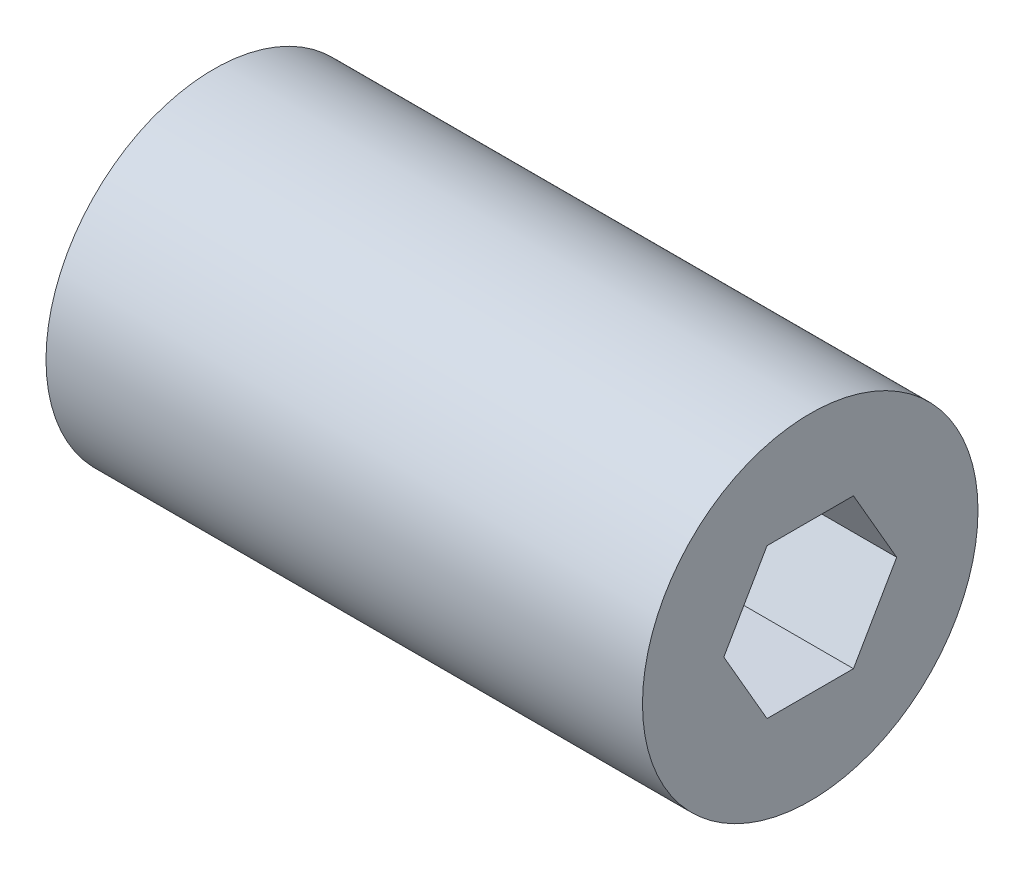
ISO-10303-21;
HEADER;
FILE_DESCRIPTION(('STEP AP214'),'2;1');
FILE_NAME('part.step','',(''),(''),'','','');
FILE_SCHEMA(('AUTOMOTIVE_DESIGN { 1 0 10303 214 1 1 1 1 }'));
ENDSEC;
DATA;
#1=APPLICATION_CONTEXT('core data for automotive mechanical design processes');
#2=APPLICATION_PROTOCOL_DEFINITION('international standard','automotive_design',2000,#1);
#3=PRODUCT_CONTEXT('',#1,'mechanical');
#4=PRODUCT('Part','Part','',(#3));
#5=PRODUCT_RELATED_PRODUCT_CATEGORY('part','',(#4));
#6=PRODUCT_DEFINITION_FORMATION('','',#4);
#7=PRODUCT_DEFINITION_CONTEXT('part definition',#1,'design');
#8=PRODUCT_DEFINITION('design','',#6,#7);
#9=PRODUCT_DEFINITION_SHAPE('','',#8);
#10=(LENGTH_UNIT() NAMED_UNIT(*) SI_UNIT(.MILLI.,.METRE.));
#11=(NAMED_UNIT(*) PLANE_ANGLE_UNIT() SI_UNIT($,.RADIAN.));
#12=(NAMED_UNIT(*) SI_UNIT($,.STERADIAN.) SOLID_ANGLE_UNIT());
#13=UNCERTAINTY_MEASURE_WITH_UNIT(LENGTH_MEASURE(1.E-05),#10,'distance_accuracy_value','');
#14=(GEOMETRIC_REPRESENTATION_CONTEXT(3) GLOBAL_UNCERTAINTY_ASSIGNED_CONTEXT((#13)) GLOBAL_UNIT_ASSIGNED_CONTEXT((#10,
#11,#12)) REPRESENTATION_CONTEXT('',''));
#15=CARTESIAN_POINT('',(0.,0.,0.));
#16=DIRECTION('',(0.,0.,1.));
#17=DIRECTION('',(1.,0.,0.));
#18=AXIS2_PLACEMENT_3D('',#15,#16,#17);
#19=CARTESIAN_POINT('',(25.4,-6.3754,3.68083890619154));
#20=DIRECTION('',(0.,1.,0.));
#21=DIRECTION('',(0.,0.,1.));
#22=AXIS2_PLACEMENT_3D('',#19,#20,#21);
#23=PLANE('',#22);
#24=DIRECTION('',(0.,0.,-1.));
#25=VECTOR('',#24,1.);
#26=CARTESIAN_POINT('',(25.4,-6.37540000000001,0.));
#27=LINE('',#26,#25);
#28=CARTESIAN_POINT('',(25.4,-6.37540000000001,-3.68083890619154));
#29=VERTEX_POINT('',#28);
#30=CARTESIAN_POINT('',(25.4,-6.3754,3.68083890619154));
#31=VERTEX_POINT('',#30);
#32=EDGE_CURVE('E84',#29,#31,#27,.F.);
#33=ORIENTED_EDGE('',*,*,#32,.F.);
#34=DIRECTION('',(1.,0.,0.));
#35=VECTOR('',#34,1.);
#36=CARTESIAN_POINT('',(25.4,-6.37540000000001,-3.68083890619154));
#37=LINE('',#36,#35);
#38=CARTESIAN_POINT('',(-25.4,-6.37540000000001,-3.68083890619154));
#39=VERTEX_POINT('',#38);
#40=EDGE_CURVE('E76',#39,#29,#37,.T.);
#41=ORIENTED_EDGE('',*,*,#40,.F.);
#42=DIRECTION('',(0.,0.,-1.));
#43=VECTOR('',#42,1.);
#44=CARTESIAN_POINT('',(-25.4,-6.37540000000001,0.));
#45=LINE('',#44,#43);
#46=CARTESIAN_POINT('',(-25.4,-6.3754,3.68083890619154));
#47=VERTEX_POINT('',#46);
#48=EDGE_CURVE('E116',#39,#47,#45,.F.);
#49=ORIENTED_EDGE('',*,*,#48,.T.);
#50=DIRECTION('',(1.,0.,0.));
#51=VECTOR('',#50,1.);
#52=CARTESIAN_POINT('',(25.4,-6.3754,3.68083890619154));
#53=LINE('',#52,#51);
#54=EDGE_CURVE('E101',#31,#47,#53,.F.);
#55=ORIENTED_EDGE('',*,*,#54,.F.);
#56=EDGE_LOOP('',(#33,#41,#49,#55));
#57=FACE_BOUND('',#56,.T.);
#58=ADVANCED_FACE('F17',(#57),#23,.T.);
#59=CARTESIAN_POINT('',(25.4,0.,7.36167781238308));
#60=DIRECTION('',(0.,0.5,-0.866025403784439));
#61=DIRECTION('',(0.,0.866025403784439,0.5));
#62=AXIS2_PLACEMENT_3D('',#59,#60,#61);
#63=PLANE('',#62);
#64=DIRECTION('',(0.,0.866025403784439,0.5));
#65=VECTOR('',#64,1.);
#66=CARTESIAN_POINT('',(25.4,-6.3754,3.68083890619154));
#67=LINE('',#66,#65);
#68=CARTESIAN_POINT('',(25.4,0.,7.36167781238308));
#69=VERTEX_POINT('',#68);
#70=EDGE_CURVE('E109',#31,#69,#67,.T.);
#71=ORIENTED_EDGE('',*,*,#70,.F.);
#72=ORIENTED_EDGE('',*,*,#54,.T.);
#73=DIRECTION('',(0.,0.866025403784439,0.5));
#74=VECTOR('',#73,1.);
#75=CARTESIAN_POINT('',(-25.4,-6.3754,3.68083890619154));
#76=LINE('',#75,#74);
#77=CARTESIAN_POINT('',(-25.4,0.,7.36167781238308));
#78=VERTEX_POINT('',#77);
#79=EDGE_CURVE('E107',#47,#78,#76,.T.);
#80=ORIENTED_EDGE('',*,*,#79,.T.);
#81=DIRECTION('',(1.,0.,0.));
#82=VECTOR('',#81,1.);
#83=CARTESIAN_POINT('',(25.4,0.,7.36167781238308));
#84=LINE('',#83,#82);
#85=EDGE_CURVE('E98',#69,#78,#84,.F.);
#86=ORIENTED_EDGE('',*,*,#85,.F.);
#87=EDGE_LOOP('',(#71,#72,#80,#86));
#88=FACE_BOUND('',#87,.T.);
#89=ADVANCED_FACE('F106',(#88),#63,.T.);
#90=CARTESIAN_POINT('',(25.4,6.37540000000001,3.68083890619154));
#91=DIRECTION('',(0.,-0.5,-0.866025403784439));
#92=DIRECTION('',(0.,0.866025403784439,-0.5));
#93=AXIS2_PLACEMENT_3D('',#90,#91,#92);
#94=PLANE('',#93);
#95=DIRECTION('',(0.,0.866025403784439,-0.5));
#96=VECTOR('',#95,1.);
#97=CARTESIAN_POINT('',(25.4,0.,7.36167781238308));
#98=LINE('',#97,#96);
#99=CARTESIAN_POINT('',(25.4,6.37540000000001,3.68083890619154));
#100=VERTEX_POINT('',#99);
#101=EDGE_CURVE('E126',#69,#100,#98,.T.);
#102=ORIENTED_EDGE('',*,*,#101,.F.);
#103=ORIENTED_EDGE('',*,*,#85,.T.);
#104=DIRECTION('',(0.,0.866025403784439,-0.5));
#105=VECTOR('',#104,1.);
#106=CARTESIAN_POINT('',(-25.4,0.,7.36167781238308));
#107=LINE('',#106,#105);
#108=CARTESIAN_POINT('',(-25.4,6.37540000000001,3.68083890619154));
#109=VERTEX_POINT('',#108);
#110=EDGE_CURVE('E118',#78,#109,#107,.T.);
#111=ORIENTED_EDGE('',*,*,#110,.T.);
#112=DIRECTION('',(1.,0.,0.));
#113=VECTOR('',#112,1.);
#114=CARTESIAN_POINT('',(25.4,6.37540000000001,3.68083890619154));
#115=LINE('',#114,#113);
#116=EDGE_CURVE('E95',#100,#109,#115,.F.);
#117=ORIENTED_EDGE('',*,*,#116,.F.);
#118=EDGE_LOOP('',(#102,#103,#111,#117));
#119=FACE_BOUND('',#118,.T.);
#120=ADVANCED_FACE('F135',(#119),#94,.T.);
#121=CARTESIAN_POINT('',(25.4,6.37540000000001,-3.68083890619154));
#122=DIRECTION('',(0.,-1.,0.));
#123=DIRECTION('',(0.,0.,-1.));
#124=AXIS2_PLACEMENT_3D('',#121,#122,#123);
#125=PLANE('',#124);
#126=DIRECTION('',(0.,0.,-1.));
#127=VECTOR('',#126,1.);
#128=CARTESIAN_POINT('',(25.4,6.37540000000001,0.));
#129=LINE('',#128,#127);
#130=CARTESIAN_POINT('',(25.4,6.37540000000001,-3.68083890619154));
#131=VERTEX_POINT('',#130);
#132=EDGE_CURVE('E89',#100,#131,#129,.T.);
#133=ORIENTED_EDGE('',*,*,#132,.F.);
#134=ORIENTED_EDGE('',*,*,#116,.T.);
#135=DIRECTION('',(0.,0.,-1.));
#136=VECTOR('',#135,1.);
#137=CARTESIAN_POINT('',(-25.4,6.37540000000001,0.));
#138=LINE('',#137,#136);
#139=CARTESIAN_POINT('',(-25.4,6.37540000000001,-3.68083890619154));
#140=VERTEX_POINT('',#139);
#141=EDGE_CURVE('E120',#109,#140,#138,.T.);
#142=ORIENTED_EDGE('',*,*,#141,.T.);
#143=DIRECTION('',(1.,0.,0.));
#144=VECTOR('',#143,1.);
#145=CARTESIAN_POINT('',(25.4,6.37540000000001,-3.68083890619153));
#146=LINE('',#145,#144);
#147=EDGE_CURVE('E65',#131,#140,#146,.F.);
#148=ORIENTED_EDGE('',*,*,#147,.F.);
#149=EDGE_LOOP('',(#133,#134,#142,#148));
#150=FACE_BOUND('',#149,.T.);
#151=ADVANCED_FACE('F132',(#150),#125,.T.);
#152=CARTESIAN_POINT('',(25.4,0.,-7.36167781238308));
#153=DIRECTION('',(0.,-0.5,0.866025403784439));
#154=DIRECTION('',(0.,-0.866025403784439,-0.5));
#155=AXIS2_PLACEMENT_3D('',#152,#153,#154);
#156=PLANE('',#155);
#157=DIRECTION('',(0.,-0.866025403784438,-0.5));
#158=VECTOR('',#157,1.);
#159=CARTESIAN_POINT('',(25.4,6.37540000000001,-3.68083890619154));
#160=LINE('',#159,#158);
#161=CARTESIAN_POINT('',(25.4,0.,-7.36167781238308));
#162=VERTEX_POINT('',#161);
#163=EDGE_CURVE('E71',#131,#162,#160,.T.);
#164=ORIENTED_EDGE('',*,*,#163,.F.);
#165=ORIENTED_EDGE('',*,*,#147,.T.);
#166=DIRECTION('',(0.,-0.866025403784438,-0.5));
#167=VECTOR('',#166,1.);
#168=CARTESIAN_POINT('',(-25.4,6.37540000000001,-3.68083890619154));
#169=LINE('',#168,#167);
#170=CARTESIAN_POINT('',(-25.4,0.,-7.36167781238308));
#171=VERTEX_POINT('',#170);
#172=EDGE_CURVE('E33',#140,#171,#169,.T.);
#173=ORIENTED_EDGE('',*,*,#172,.T.);
#174=DIRECTION('',(1.,0.,0.));
#175=VECTOR('',#174,1.);
#176=CARTESIAN_POINT('',(25.4,0.,-7.36167781238308));
#177=LINE('',#176,#175);
#178=EDGE_CURVE('E67',#162,#171,#177,.F.);
#179=ORIENTED_EDGE('',*,*,#178,.F.);
#180=EDGE_LOOP('',(#164,#165,#173,#179));
#181=FACE_BOUND('',#180,.T.);
#182=ADVANCED_FACE('F69',(#181),#156,.T.);
#183=CARTESIAN_POINT('',(25.4,-6.37540000000001,-3.68083890619154));
#184=DIRECTION('',(0.,0.5,0.866025403784439));
#185=DIRECTION('',(0.,-0.866025403784439,0.5));
#186=AXIS2_PLACEMENT_3D('',#183,#184,#185);
#187=PLANE('',#186);
#188=DIRECTION('',(0.,-0.866025403784439,0.499999999999999));
#189=VECTOR('',#188,1.);
#190=CARTESIAN_POINT('',(25.4,0.,-7.36167781238308));
#191=LINE('',#190,#189);
#192=EDGE_CURVE('E79',#162,#29,#191,.T.);
#193=ORIENTED_EDGE('',*,*,#192,.F.);
#194=ORIENTED_EDGE('',*,*,#178,.T.);
#195=DIRECTION('',(0.,-0.866025403784439,0.499999999999999));
#196=VECTOR('',#195,1.);
#197=CARTESIAN_POINT('',(-25.4,0.,-7.36167781238308));
#198=LINE('',#197,#196);
#199=EDGE_CURVE('E128',#171,#39,#198,.T.);
#200=ORIENTED_EDGE('',*,*,#199,.T.);
#201=ORIENTED_EDGE('',*,*,#40,.T.);
#202=EDGE_LOOP('',(#193,#194,#200,#201));
#203=FACE_BOUND('',#202,.T.);
#204=ADVANCED_FACE('F80',(#203),#187,.T.);
#205=CARTESIAN_POINT('',(25.4,0.,0.));
#206=DIRECTION('',(1.,0.,0.));
#207=DIRECTION('',(0.,0.,-1.));
#208=AXIS2_PLACEMENT_3D('',#205,#206,#207);
#209=PLANE('',#208);
#210=ORIENTED_EDGE('',*,*,#101,.T.);
#211=ORIENTED_EDGE('',*,*,#132,.T.);
#212=ORIENTED_EDGE('',*,*,#163,.T.);
#213=ORIENTED_EDGE('',*,*,#192,.T.);
#214=ORIENTED_EDGE('',*,*,#32,.T.);
#215=ORIENTED_EDGE('',*,*,#70,.T.);
#216=EDGE_LOOP('',(#210,#211,#212,#213,#214,#215));
#217=FACE_BOUND('',#216,.T.);
#218=CARTESIAN_POINT('',(25.4,0.,0.));
#219=DIRECTION('',(-1.,0.,0.));
#220=DIRECTION('',(0.,0.,1.));
#221=AXIS2_PLACEMENT_3D('',#218,#219,#220);
#222=CIRCLE('',#221,14.2875);
#223=CARTESIAN_POINT('',(25.4,0.,14.2875));
#224=VERTEX_POINT('',#223);
#225=EDGE_CURVE('E20',#224,#224,#222,.T.);
#226=ORIENTED_EDGE('',*,*,#225,.F.);
#227=EDGE_LOOP('',(#226));
#228=FACE_BOUND('',#227,.T.);
#229=ADVANCED_FACE('F87',(#217,#228),#209,.T.);
#230=CARTESIAN_POINT('',(-25.4,0.,0.));
#231=DIRECTION('',(1.,0.,0.));
#232=DIRECTION('',(0.,0.,-1.));
#233=AXIS2_PLACEMENT_3D('',#230,#231,#232);
#234=PLANE('',#233);
#235=ORIENTED_EDGE('',*,*,#172,.F.);
#236=ORIENTED_EDGE('',*,*,#141,.F.);
#237=ORIENTED_EDGE('',*,*,#110,.F.);
#238=ORIENTED_EDGE('',*,*,#79,.F.);
#239=ORIENTED_EDGE('',*,*,#48,.F.);
#240=ORIENTED_EDGE('',*,*,#199,.F.);
#241=EDGE_LOOP('',(#235,#236,#237,#238,#239,#240));
#242=FACE_BOUND('',#241,.T.);
#243=CARTESIAN_POINT('',(-25.4,0.,0.));
#244=DIRECTION('',(-1.,0.,0.));
#245=DIRECTION('',(0.,0.,1.));
#246=AXIS2_PLACEMENT_3D('',#243,#244,#245);
#247=CIRCLE('',#246,14.2875);
#248=CARTESIAN_POINT('',(-25.4,0.,14.2875));
#249=VERTEX_POINT('',#248);
#250=EDGE_CURVE('E11',#249,#249,#247,.F.);
#251=ORIENTED_EDGE('',*,*,#250,.F.);
#252=EDGE_LOOP('',(#251));
#253=FACE_BOUND('',#252,.T.);
#254=ADVANCED_FACE('F114',(#242,#253),#234,.F.);
#255=CARTESIAN_POINT('',(25.4,0.,0.));
#256=DIRECTION('',(-1.,0.,0.));
#257=DIRECTION('',(0.,0.,1.));
#258=AXIS2_PLACEMENT_3D('',#255,#256,#257);
#259=CYLINDRICAL_SURFACE('',#258,14.2875);
#260=ORIENTED_EDGE('',*,*,#250,.T.);
#261=EDGE_LOOP('',(#260));
#262=FACE_BOUND('',#261,.T.);
#263=ORIENTED_EDGE('',*,*,#225,.T.);
#264=EDGE_LOOP('',(#263));
#265=FACE_BOUND('',#264,.T.);
#266=ADVANCED_FACE('F144',(#262,#265),#259,.T.);
#267=CLOSED_SHELL('',(#58,#89,#120,#151,#182,#204,#229,#254,#266));
#268=MANIFOLD_SOLID_BREP('B1',#267);
#269=ADVANCED_BREP_SHAPE_REPRESENTATION('',(#18,#268),#14);
#270=SHAPE_DEFINITION_REPRESENTATION(#9,#269);
ENDSEC;
END-ISO-10303-21;
